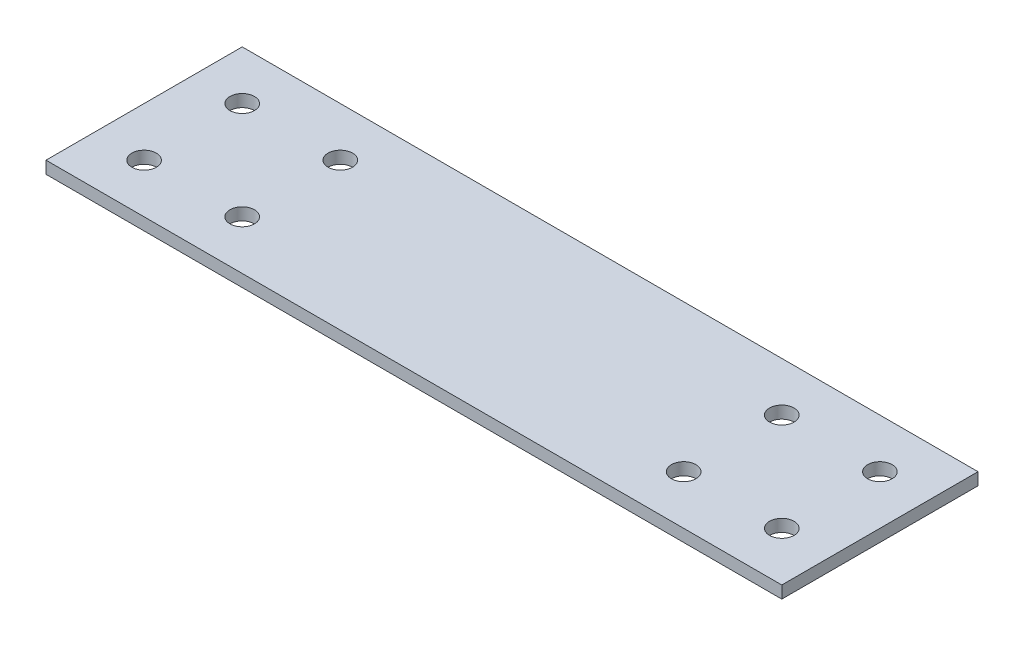
ISO-10303-21;
HEADER;
FILE_DESCRIPTION(('STEP AP214'),'2;1');
FILE_NAME('part.step','',(''),(''),'','','');
FILE_SCHEMA(('AUTOMOTIVE_DESIGN { 1 0 10303 214 1 1 1 1 }'));
ENDSEC;
DATA;
#1=APPLICATION_CONTEXT('core data for automotive mechanical design processes');
#2=APPLICATION_PROTOCOL_DEFINITION('international standard','automotive_design',2000,#1);
#3=PRODUCT_CONTEXT('',#1,'mechanical');
#4=PRODUCT('Part','Part','',(#3));
#5=PRODUCT_RELATED_PRODUCT_CATEGORY('part','',(#4));
#6=PRODUCT_DEFINITION_FORMATION('','',#4);
#7=PRODUCT_DEFINITION_CONTEXT('part definition',#1,'design');
#8=PRODUCT_DEFINITION('design','',#6,#7);
#9=PRODUCT_DEFINITION_SHAPE('','',#8);
#10=(LENGTH_UNIT() NAMED_UNIT(*) SI_UNIT(.MILLI.,.METRE.));
#11=(NAMED_UNIT(*) PLANE_ANGLE_UNIT() SI_UNIT($,.RADIAN.));
#12=(NAMED_UNIT(*) SI_UNIT($,.STERADIAN.) SOLID_ANGLE_UNIT());
#13=UNCERTAINTY_MEASURE_WITH_UNIT(LENGTH_MEASURE(1.E-05),#10,'distance_accuracy_value','');
#14=(GEOMETRIC_REPRESENTATION_CONTEXT(3) GLOBAL_UNCERTAINTY_ASSIGNED_CONTEXT((#13)) GLOBAL_UNIT_ASSIGNED_CONTEXT((#10,
#11,#12)) REPRESENTATION_CONTEXT('',''));
#15=CARTESIAN_POINT('',(0.,0.,0.));
#16=DIRECTION('',(0.,0.,1.));
#17=DIRECTION('',(1.,0.,0.));
#18=AXIS2_PLACEMENT_3D('',#15,#16,#17);
#19=CARTESIAN_POINT('',(69.85,25.4,25.4));
#20=DIRECTION('',(0.,0.,-1.));
#21=DIRECTION('',(-1.,0.,0.));
#22=AXIS2_PLACEMENT_3D('',#19,#20,#21);
#23=PLANE('',#22);
#24=DIRECTION('',(1.,0.,0.));
#25=VECTOR('',#24,1.);
#26=CARTESIAN_POINT('',(69.85,25.4,25.4));
#27=LINE('',#26,#25);
#28=CARTESIAN_POINT('',(-95.25,25.4,25.4));
#29=VERTEX_POINT('',#28);
#30=CARTESIAN_POINT('',(95.25,25.4,25.4));
#31=VERTEX_POINT('',#30);
#32=EDGE_CURVE('E44',#29,#31,#27,.T.);
#33=ORIENTED_EDGE('',*,*,#32,.F.);
#34=DIRECTION('',(0.,1.,0.));
#35=VECTOR('',#34,1.);
#36=CARTESIAN_POINT('',(-95.25,22.225,25.4));
#37=LINE('',#36,#35);
#38=CARTESIAN_POINT('',(-95.25,22.225,25.4));
#39=VERTEX_POINT('',#38);
#40=EDGE_CURVE('E108',#39,#29,#37,.T.);
#41=ORIENTED_EDGE('',*,*,#40,.F.);
#42=DIRECTION('',(-1.,0.,0.));
#43=VECTOR('',#42,1.);
#44=CARTESIAN_POINT('',(69.851,22.225,25.4));
#45=LINE('',#44,#43);
#46=CARTESIAN_POINT('',(95.25,22.225,25.4));
#47=VERTEX_POINT('',#46);
#48=EDGE_CURVE('E58',#47,#39,#45,.T.);
#49=ORIENTED_EDGE('',*,*,#48,.F.);
#50=DIRECTION('',(0.,-1.,0.));
#51=VECTOR('',#50,1.);
#52=CARTESIAN_POINT('',(95.25,25.4,25.4));
#53=LINE('',#52,#51);
#54=EDGE_CURVE('E84',#31,#47,#53,.T.);
#55=ORIENTED_EDGE('',*,*,#54,.F.);
#56=EDGE_LOOP('',(#33,#41,#49,#55));
#57=FACE_BOUND('',#56,.T.);
#58=ADVANCED_FACE('F37',(#57),#23,.F.);
#59=CARTESIAN_POINT('',(69.85,25.4,-25.4));
#60=DIRECTION('',(0.,0.,1.));
#61=DIRECTION('',(1.,0.,0.));
#62=AXIS2_PLACEMENT_3D('',#59,#60,#61);
#63=PLANE('',#62);
#64=DIRECTION('',(-1.,0.,0.));
#65=VECTOR('',#64,1.);
#66=CARTESIAN_POINT('',(69.85,25.4,-25.4));
#67=LINE('',#66,#65);
#68=CARTESIAN_POINT('',(95.25,25.4,-25.4));
#69=VERTEX_POINT('',#68);
#70=CARTESIAN_POINT('',(-95.25,25.4,-25.4));
#71=VERTEX_POINT('',#70);
#72=EDGE_CURVE('E11',#69,#71,#67,.T.);
#73=ORIENTED_EDGE('',*,*,#72,.F.);
#74=DIRECTION('',(0.,1.,0.));
#75=VECTOR('',#74,1.);
#76=CARTESIAN_POINT('',(95.25,22.225,-25.4));
#77=LINE('',#76,#75);
#78=CARTESIAN_POINT('',(95.25,22.225,-25.4));
#79=VERTEX_POINT('',#78);
#80=EDGE_CURVE('E92',#79,#69,#77,.T.);
#81=ORIENTED_EDGE('',*,*,#80,.F.);
#82=DIRECTION('',(-1.,0.,0.));
#83=VECTOR('',#82,1.);
#84=CARTESIAN_POINT('',(69.851,22.225,-25.4));
#85=LINE('',#84,#83);
#86=CARTESIAN_POINT('',(-95.25,22.225,-25.4));
#87=VERTEX_POINT('',#86);
#88=EDGE_CURVE('E82',#79,#87,#85,.T.);
#89=ORIENTED_EDGE('',*,*,#88,.T.);
#90=DIRECTION('',(0.,-1.,0.));
#91=VECTOR('',#90,1.);
#92=CARTESIAN_POINT('',(-95.25,25.4,-25.4));
#93=LINE('',#92,#91);
#94=EDGE_CURVE('E103',#71,#87,#93,.T.);
#95=ORIENTED_EDGE('',*,*,#94,.F.);
#96=EDGE_LOOP('',(#73,#81,#89,#95));
#97=FACE_BOUND('',#96,.T.);
#98=ADVANCED_FACE('F137',(#97),#63,.F.);
#99=CARTESIAN_POINT('',(0.,25.4,0.));
#100=DIRECTION('',(0.,1.,0.));
#101=DIRECTION('',(0.,0.,1.));
#102=AXIS2_PLACEMENT_3D('',#99,#100,#101);
#103=PLANE('',#102);
#104=CARTESIAN_POINT('',(82.55,25.4,-12.7));
#105=DIRECTION('',(0.,1.,0.));
#106=DIRECTION('',(0.,0.,-1.));
#107=AXIS2_PLACEMENT_3D('',#104,#105,#106);
#108=CIRCLE('',#107,3.175);
#109=CARTESIAN_POINT('',(82.55,25.4,-15.875));
#110=VERTEX_POINT('',#109);
#111=EDGE_CURVE('E346',#110,#110,#108,.T.);
#112=ORIENTED_EDGE('',*,*,#111,.F.);
#113=EDGE_LOOP('',(#112));
#114=FACE_BOUND('',#113,.T.);
#115=CARTESIAN_POINT('',(82.55,25.4,12.7000000000001));
#116=DIRECTION('',(0.,1.,0.));
#117=DIRECTION('',(0.,0.,1.));
#118=AXIS2_PLACEMENT_3D('',#115,#116,#117);
#119=CIRCLE('',#118,3.175);
#120=CARTESIAN_POINT('',(82.55,25.4,15.8750000000001));
#121=VERTEX_POINT('',#120);
#122=EDGE_CURVE('E353',#121,#121,#119,.T.);
#123=ORIENTED_EDGE('',*,*,#122,.F.);
#124=EDGE_LOOP('',(#123));
#125=FACE_BOUND('',#124,.T.);
#126=CARTESIAN_POINT('',(-82.55,25.4,12.7));
#127=DIRECTION('',(0.,1.,0.));
#128=DIRECTION('',(0.,0.,-1.));
#129=AXIS2_PLACEMENT_3D('',#126,#127,#128);
#130=CIRCLE('',#129,3.175);
#131=CARTESIAN_POINT('',(-82.55,25.4,9.52500000000002));
#132=VERTEX_POINT('',#131);
#133=EDGE_CURVE('E356',#132,#132,#130,.T.);
#134=ORIENTED_EDGE('',*,*,#133,.F.);
#135=EDGE_LOOP('',(#134));
#136=FACE_BOUND('',#135,.T.);
#137=CARTESIAN_POINT('',(-82.55,25.4,-12.7));
#138=DIRECTION('',(0.,1.,0.));
#139=DIRECTION('',(0.,0.,1.));
#140=AXIS2_PLACEMENT_3D('',#137,#138,#139);
#141=CIRCLE('',#140,3.175);
#142=CARTESIAN_POINT('',(-82.55,25.4,-9.52500000000001));
#143=VERTEX_POINT('',#142);
#144=EDGE_CURVE('E96',#143,#143,#141,.T.);
#145=ORIENTED_EDGE('',*,*,#144,.F.);
#146=EDGE_LOOP('',(#145));
#147=FACE_BOUND('',#146,.T.);
#148=CARTESIAN_POINT('',(57.15,25.4,-12.7));
#149=DIRECTION('',(0.,1.,0.));
#150=DIRECTION('',(0.,0.,-1.));
#151=AXIS2_PLACEMENT_3D('',#148,#149,#150);
#152=CIRCLE('',#151,3.175);
#153=CARTESIAN_POINT('',(57.15,25.4,-9.52500000000002));
#154=VERTEX_POINT('',#153);
#155=EDGE_CURVE('E124',#154,#154,#152,.T.);
#156=ORIENTED_EDGE('',*,*,#155,.F.);
#157=EDGE_LOOP('',(#156));
#158=FACE_BOUND('',#157,.T.);
#159=CARTESIAN_POINT('',(57.15,25.4,12.7));
#160=DIRECTION('',(0.,1.,0.));
#161=DIRECTION('',(0.,0.,1.));
#162=AXIS2_PLACEMENT_3D('',#159,#160,#161);
#163=CIRCLE('',#162,3.175);
#164=CARTESIAN_POINT('',(57.15,25.4,15.875));
#165=VERTEX_POINT('',#164);
#166=EDGE_CURVE('E118',#165,#165,#163,.T.);
#167=ORIENTED_EDGE('',*,*,#166,.F.);
#168=EDGE_LOOP('',(#167));
#169=FACE_BOUND('',#168,.T.);
#170=CARTESIAN_POINT('',(-57.15,25.4,12.7));
#171=DIRECTION('',(0.,1.,0.));
#172=DIRECTION('',(0.,0.,-1.));
#173=AXIS2_PLACEMENT_3D('',#170,#171,#172);
#174=CIRCLE('',#173,3.175);
#175=CARTESIAN_POINT('',(-57.15,25.4,15.875));
#176=VERTEX_POINT('',#175);
#177=EDGE_CURVE('E111',#176,#176,#174,.T.);
#178=ORIENTED_EDGE('',*,*,#177,.F.);
#179=EDGE_LOOP('',(#178));
#180=FACE_BOUND('',#179,.T.);
#181=CARTESIAN_POINT('',(-57.15,25.4,-12.7));
#182=DIRECTION('',(0.,1.,0.));
#183=DIRECTION('',(0.,0.,1.));
#184=AXIS2_PLACEMENT_3D('',#181,#182,#183);
#185=CIRCLE('',#184,3.175);
#186=CARTESIAN_POINT('',(-57.15,25.4,-9.52500000000002));
#187=VERTEX_POINT('',#186);
#188=EDGE_CURVE('E114',#187,#187,#185,.T.);
#189=ORIENTED_EDGE('',*,*,#188,.F.);
#190=EDGE_LOOP('',(#189));
#191=FACE_BOUND('',#190,.T.);
#192=ORIENTED_EDGE('',*,*,#72,.T.);
#193=DIRECTION('',(0.,0.,-1.));
#194=VECTOR('',#193,1.);
#195=CARTESIAN_POINT('',(-95.25,25.4,25.4));
#196=LINE('',#195,#194);
#197=EDGE_CURVE('E81',#29,#71,#196,.T.);
#198=ORIENTED_EDGE('',*,*,#197,.F.);
#199=ORIENTED_EDGE('',*,*,#32,.T.);
#200=DIRECTION('',(0.,0.,1.));
#201=VECTOR('',#200,1.);
#202=CARTESIAN_POINT('',(95.25,25.4,-25.4));
#203=LINE('',#202,#201);
#204=EDGE_CURVE('E79',#69,#31,#203,.T.);
#205=ORIENTED_EDGE('',*,*,#204,.F.);
#206=EDGE_LOOP('',(#192,#198,#199,#205));
#207=FACE_BOUND('',#206,.T.);
#208=ADVANCED_FACE('F77',(#114,#125,#136,#147,#158,#169,#180,#191,#207),#103,.T.);
#209=CARTESIAN_POINT('',(69.851,22.225,25.4));
#210=DIRECTION('',(0.,1.,0.));
#211=DIRECTION('',(0.,0.,1.));
#212=AXIS2_PLACEMENT_3D('',#209,#210,#211);
#213=PLANE('',#212);
#214=CARTESIAN_POINT('',(82.55,22.225,-12.7));
#215=DIRECTION('',(0.,1.,0.));
#216=DIRECTION('',(0.,0.,1.));
#217=AXIS2_PLACEMENT_3D('',#214,#215,#216);
#218=CIRCLE('',#217,3.175);
#219=CARTESIAN_POINT('',(82.55,22.225,-9.52499999999997));
#220=VERTEX_POINT('',#219);
#221=EDGE_CURVE('E348',#220,#220,#218,.F.);
#222=ORIENTED_EDGE('',*,*,#221,.F.);
#223=EDGE_LOOP('',(#222));
#224=FACE_BOUND('',#223,.T.);
#225=CARTESIAN_POINT('',(82.55,22.225,12.7000000000001));
#226=DIRECTION('',(0.,1.,0.));
#227=DIRECTION('',(0.,0.,1.));
#228=AXIS2_PLACEMENT_3D('',#225,#226,#227);
#229=CIRCLE('',#228,3.175);
#230=CARTESIAN_POINT('',(82.55,22.225,15.8750000000001));
#231=VERTEX_POINT('',#230);
#232=EDGE_CURVE('E350',#231,#231,#229,.F.);
#233=ORIENTED_EDGE('',*,*,#232,.F.);
#234=EDGE_LOOP('',(#233));
#235=FACE_BOUND('',#234,.T.);
#236=CARTESIAN_POINT('',(-82.55,22.225,12.7));
#237=DIRECTION('',(0.,1.,0.));
#238=DIRECTION('',(0.,0.,1.));
#239=AXIS2_PLACEMENT_3D('',#236,#237,#238);
#240=CIRCLE('',#239,3.175);
#241=CARTESIAN_POINT('',(-82.55,22.225,15.875));
#242=VERTEX_POINT('',#241);
#243=EDGE_CURVE('E359',#242,#242,#240,.F.);
#244=ORIENTED_EDGE('',*,*,#243,.F.);
#245=EDGE_LOOP('',(#244));
#246=FACE_BOUND('',#245,.T.);
#247=CARTESIAN_POINT('',(-82.55,22.225,-12.7));
#248=DIRECTION('',(0.,1.,0.));
#249=DIRECTION('',(0.,0.,1.));
#250=AXIS2_PLACEMENT_3D('',#247,#248,#249);
#251=CIRCLE('',#250,3.175);
#252=CARTESIAN_POINT('',(-82.55,22.225,-9.52500000000001));
#253=VERTEX_POINT('',#252);
#254=EDGE_CURVE('E93',#253,#253,#251,.F.);
#255=ORIENTED_EDGE('',*,*,#254,.F.);
#256=EDGE_LOOP('',(#255));
#257=FACE_BOUND('',#256,.T.);
#258=CARTESIAN_POINT('',(57.15,22.225,-12.7));
#259=DIRECTION('',(0.,1.,0.));
#260=DIRECTION('',(0.,0.,-1.));
#261=AXIS2_PLACEMENT_3D('',#258,#259,#260);
#262=CIRCLE('',#261,3.175);
#263=CARTESIAN_POINT('',(57.15,22.225,-9.52500000000002));
#264=VERTEX_POINT('',#263);
#265=EDGE_CURVE('E110',#264,#264,#262,.T.);
#266=ORIENTED_EDGE('',*,*,#265,.T.);
#267=EDGE_LOOP('',(#266));
#268=FACE_BOUND('',#267,.T.);
#269=CARTESIAN_POINT('',(57.15,22.225,12.7));
#270=DIRECTION('',(0.,1.,0.));
#271=DIRECTION('',(0.,0.,1.));
#272=AXIS2_PLACEMENT_3D('',#269,#270,#271);
#273=CIRCLE('',#272,3.175);
#274=CARTESIAN_POINT('',(57.15,22.225,15.875));
#275=VERTEX_POINT('',#274);
#276=EDGE_CURVE('E121',#275,#275,#273,.T.);
#277=ORIENTED_EDGE('',*,*,#276,.T.);
#278=EDGE_LOOP('',(#277));
#279=FACE_BOUND('',#278,.T.);
#280=CARTESIAN_POINT('',(-57.15,22.225,12.7));
#281=DIRECTION('',(0.,1.,0.));
#282=DIRECTION('',(0.,0.,-1.));
#283=AXIS2_PLACEMENT_3D('',#280,#281,#282);
#284=CIRCLE('',#283,3.175);
#285=CARTESIAN_POINT('',(-57.15,22.225,15.875));
#286=VERTEX_POINT('',#285);
#287=EDGE_CURVE('E115',#286,#286,#284,.T.);
#288=ORIENTED_EDGE('',*,*,#287,.T.);
#289=EDGE_LOOP('',(#288));
#290=FACE_BOUND('',#289,.T.);
#291=CARTESIAN_POINT('',(-57.15,22.225,-12.7));
#292=DIRECTION('',(0.,1.,0.));
#293=DIRECTION('',(0.,0.,1.));
#294=AXIS2_PLACEMENT_3D('',#291,#292,#293);
#295=CIRCLE('',#294,3.175);
#296=CARTESIAN_POINT('',(-57.15,22.225,-9.52500000000002));
#297=VERTEX_POINT('',#296);
#298=EDGE_CURVE('E129',#297,#297,#295,.T.);
#299=ORIENTED_EDGE('',*,*,#298,.T.);
#300=EDGE_LOOP('',(#299));
#301=FACE_BOUND('',#300,.T.);
#302=ORIENTED_EDGE('',*,*,#88,.F.);
#303=DIRECTION('',(0.,0.,-1.));
#304=VECTOR('',#303,1.);
#305=CARTESIAN_POINT('',(95.25,22.225,25.4));
#306=LINE('',#305,#304);
#307=EDGE_CURVE('E87',#47,#79,#306,.T.);
#308=ORIENTED_EDGE('',*,*,#307,.F.);
#309=ORIENTED_EDGE('',*,*,#48,.T.);
#310=DIRECTION('',(0.,0.,1.));
#311=VECTOR('',#310,1.);
#312=CARTESIAN_POINT('',(-95.25,22.225,-25.4));
#313=LINE('',#312,#311);
#314=EDGE_CURVE('E106',#87,#39,#313,.T.);
#315=ORIENTED_EDGE('',*,*,#314,.F.);
#316=EDGE_LOOP('',(#302,#308,#309,#315));
#317=FACE_BOUND('',#316,.T.);
#318=ADVANCED_FACE('F140',(#224,#235,#246,#257,#268,#279,#290,#301,#317),#213,.F.);
#319=CARTESIAN_POINT('',(-57.15,22.225,-12.7));
#320=DIRECTION('',(0.,1.,0.));
#321=DIRECTION('',(0.,0.,1.));
#322=AXIS2_PLACEMENT_3D('',#319,#320,#321);
#323=CYLINDRICAL_SURFACE('',#322,3.175);
#324=CARTESIAN_POINT('',(-57.15,22.225,-9.52500000000002));
#325=CARTESIAN_POINT('',(-57.15,22.2580729166667,-9.52500000000002));
#326=CARTESIAN_POINT('',(-57.15,22.2911458333333,-9.52500000000002));
#327=CARTESIAN_POINT('',(-57.15,22.3572916666667,-9.52500000000002));
#328=CARTESIAN_POINT('',(-57.15,22.3903645833333,-9.52500000000002));
#329=CARTESIAN_POINT('',(-57.15,22.4565104166667,-9.52500000000002));
#330=CARTESIAN_POINT('',(-57.15,22.4895833333333,-9.52500000000002));
#331=CARTESIAN_POINT('',(-57.15,22.5557291666667,-9.52500000000002));
#332=CARTESIAN_POINT('',(-57.15,22.5888020833333,-9.52500000000002));
#333=CARTESIAN_POINT('',(-57.15,22.6549479166667,-9.52500000000002));
#334=CARTESIAN_POINT('',(-57.15,22.6880208333333,-9.52500000000002));
#335=CARTESIAN_POINT('',(-57.15,22.7541666666667,-9.52500000000002));
#336=CARTESIAN_POINT('',(-57.15,22.7872395833333,-9.52500000000002));
#337=CARTESIAN_POINT('',(-57.15,22.8533854166667,-9.52500000000002));
#338=CARTESIAN_POINT('',(-57.15,22.8864583333333,-9.52500000000002));
#339=CARTESIAN_POINT('',(-57.15,22.9526041666667,-9.52500000000002));
#340=CARTESIAN_POINT('',(-57.15,22.9856770833333,-9.52500000000002));
#341=CARTESIAN_POINT('',(-57.15,23.0518229166667,-9.52500000000002));
#342=CARTESIAN_POINT('',(-57.15,23.0848958333333,-9.52500000000002));
#343=CARTESIAN_POINT('',(-57.15,23.1510416666667,-9.52500000000002));
#344=CARTESIAN_POINT('',(-57.15,23.1841145833333,-9.52500000000002));
#345=CARTESIAN_POINT('',(-57.15,23.2502604166667,-9.52500000000002));
#346=CARTESIAN_POINT('',(-57.15,23.2833333333333,-9.52500000000002));
#347=CARTESIAN_POINT('',(-57.15,23.3494791666667,-9.52500000000002));
#348=CARTESIAN_POINT('',(-57.15,23.3825520833333,-9.52500000000002));
#349=CARTESIAN_POINT('',(-57.15,23.4486979166667,-9.52500000000002));
#350=CARTESIAN_POINT('',(-57.15,23.4817708333333,-9.52500000000002));
#351=CARTESIAN_POINT('',(-57.15,23.5479166666667,-9.52500000000002));
#352=CARTESIAN_POINT('',(-57.15,23.5809895833333,-9.52500000000002));
#353=CARTESIAN_POINT('',(-57.15,23.6471354166667,-9.52500000000002));
#354=CARTESIAN_POINT('',(-57.15,23.6802083333333,-9.52500000000002));
#355=CARTESIAN_POINT('',(-57.15,23.7463541666667,-9.52500000000002));
#356=CARTESIAN_POINT('',(-57.15,23.7794270833333,-9.52500000000002));
#357=CARTESIAN_POINT('',(-57.15,23.8455729166667,-9.52500000000002));
#358=CARTESIAN_POINT('',(-57.15,23.8786458333333,-9.52500000000002));
#359=CARTESIAN_POINT('',(-57.15,23.9447916666667,-9.52500000000002));
#360=CARTESIAN_POINT('',(-57.15,23.9778645833333,-9.52500000000002));
#361=CARTESIAN_POINT('',(-57.15,24.0440104166667,-9.52500000000002));
#362=CARTESIAN_POINT('',(-57.15,24.0770833333333,-9.52500000000002));
#363=CARTESIAN_POINT('',(-57.15,24.1432291666667,-9.52500000000002));
#364=CARTESIAN_POINT('',(-57.15,24.1763020833333,-9.52500000000002));
#365=CARTESIAN_POINT('',(-57.15,24.2424479166667,-9.52500000000002));
#366=CARTESIAN_POINT('',(-57.15,24.2755208333333,-9.52500000000002));
#367=CARTESIAN_POINT('',(-57.15,24.3416666666667,-9.52500000000002));
#368=CARTESIAN_POINT('',(-57.15,24.3747395833333,-9.52500000000002));
#369=CARTESIAN_POINT('',(-57.15,24.4408854166667,-9.52500000000002));
#370=CARTESIAN_POINT('',(-57.15,24.4739583333333,-9.52500000000002));
#371=CARTESIAN_POINT('',(-57.15,24.5401041666667,-9.52500000000002));
#372=CARTESIAN_POINT('',(-57.15,24.5731770833333,-9.52500000000002));
#373=CARTESIAN_POINT('',(-57.15,24.6393229166667,-9.52500000000002));
#374=CARTESIAN_POINT('',(-57.15,24.6723958333333,-9.52500000000002));
#375=CARTESIAN_POINT('',(-57.15,24.7385416666667,-9.52500000000002));
#376=CARTESIAN_POINT('',(-57.15,24.7716145833333,-9.52500000000002));
#377=CARTESIAN_POINT('',(-57.15,24.8377604166667,-9.52500000000002));
#378=CARTESIAN_POINT('',(-57.15,24.8708333333333,-9.52500000000002));
#379=CARTESIAN_POINT('',(-57.15,24.9369791666667,-9.52500000000002));
#380=CARTESIAN_POINT('',(-57.15,24.9700520833333,-9.52500000000002));
#381=CARTESIAN_POINT('',(-57.15,25.0361979166667,-9.52500000000002));
#382=CARTESIAN_POINT('',(-57.15,25.0692708333333,-9.52500000000002));
#383=CARTESIAN_POINT('',(-57.15,25.1354166666667,-9.52500000000002));
#384=CARTESIAN_POINT('',(-57.15,25.1684895833333,-9.52500000000002));
#385=CARTESIAN_POINT('',(-57.15,25.2346354166667,-9.52500000000002));
#386=CARTESIAN_POINT('',(-57.15,25.2677083333333,-9.52500000000002));
#387=CARTESIAN_POINT('',(-57.15,25.3338541666667,-9.52500000000002));
#388=CARTESIAN_POINT('',(-57.15,25.3669270833333,-9.52500000000002));
#389=CARTESIAN_POINT('',(-57.15,25.4,-9.52500000000002));
#390=B_SPLINE_CURVE_WITH_KNOTS('',3,(#324,#325,#326,#327,#328,#329,#330,#331,#332,#333,#334,
#335,#336,#337,#338,#339,#340,#341,#342,#343,#344,#345,#346,#347,#348,#349,#350,#351,#352,#353,
#354,#355,#356,#357,#358,#359,#360,#361,#362,#363,#364,#365,#366,#367,#368,#369,#370,#371,#372,
#373,#374,#375,#376,#377,#378,#379,#380,#381,#382,#383,#384,#385,#386,#387,#388,#389),
.UNSPECIFIED.,.F.,.F.,(4,2,2,2,2,2,2,2,2,2,2,2,2,2,2,2,2,2,2,2,2,2,2,2,2,2,2,2,2,2,2,2,4),(0.,
0.0992187500000012,0.198437500000002,0.297656250000004,0.396875000000001,0.496093750000003,
0.595312500000004,0.694531250000005,0.793750000000003,0.892968750000004,0.992187500000005,
1.09140625,1.190625,1.28984375000001,1.3890625,1.48828125,1.58750000000001,1.68671875000001,
1.7859375,1.88515625000001,1.98437500000001,2.08359375000001,2.18281250000001,2.28203125000001,
2.38125000000001,2.48046875000001,2.57968750000001,2.67890625000001,2.77812500000001,
2.87734375000001,2.97656250000001,3.07578125000001,3.17500000000001),.UNSPECIFIED.);
#391=EDGE_CURVE('BSEAM142',#297,#187,#390,.T.);
#392=ORIENTED_EDGE('',*,*,#298,.F.);
#393=ORIENTED_EDGE('',*,*,#188,.T.);
#394=ORIENTED_EDGE('',*,*,#391,.T.);
#395=ORIENTED_EDGE('',*,*,#391,.F.);
#396=EDGE_LOOP('',(#392,#394,#393,#395));
#397=FACE_BOUND('',#396,.T.);
#398=ADVANCED_FACE('F142',(#397),#323,.F.);
#399=CARTESIAN_POINT('',(-57.15,22.225,12.7));
#400=DIRECTION('',(0.,1.,0.));
#401=DIRECTION('',(0.,0.,1.));
#402=AXIS2_PLACEMENT_3D('',#399,#400,#401);
#403=CYLINDRICAL_SURFACE('',#402,3.175);
#404=CARTESIAN_POINT('',(-57.15,22.225,15.875));
#405=CARTESIAN_POINT('',(-57.15,22.2580729166667,15.875));
#406=CARTESIAN_POINT('',(-57.15,22.2911458333333,15.875));
#407=CARTESIAN_POINT('',(-57.15,22.3572916666667,15.875));
#408=CARTESIAN_POINT('',(-57.15,22.3903645833333,15.875));
#409=CARTESIAN_POINT('',(-57.15,22.4565104166667,15.875));
#410=CARTESIAN_POINT('',(-57.15,22.4895833333333,15.875));
#411=CARTESIAN_POINT('',(-57.15,22.5557291666667,15.875));
#412=CARTESIAN_POINT('',(-57.15,22.5888020833333,15.875));
#413=CARTESIAN_POINT('',(-57.15,22.6549479166667,15.875));
#414=CARTESIAN_POINT('',(-57.15,22.6880208333333,15.875));
#415=CARTESIAN_POINT('',(-57.15,22.7541666666667,15.875));
#416=CARTESIAN_POINT('',(-57.15,22.7872395833333,15.875));
#417=CARTESIAN_POINT('',(-57.15,22.8533854166667,15.875));
#418=CARTESIAN_POINT('',(-57.15,22.8864583333333,15.875));
#419=CARTESIAN_POINT('',(-57.15,22.9526041666667,15.875));
#420=CARTESIAN_POINT('',(-57.15,22.9856770833333,15.875));
#421=CARTESIAN_POINT('',(-57.15,23.0518229166667,15.875));
#422=CARTESIAN_POINT('',(-57.15,23.0848958333333,15.875));
#423=CARTESIAN_POINT('',(-57.15,23.1510416666667,15.875));
#424=CARTESIAN_POINT('',(-57.15,23.1841145833333,15.875));
#425=CARTESIAN_POINT('',(-57.15,23.2502604166667,15.875));
#426=CARTESIAN_POINT('',(-57.15,23.2833333333333,15.875));
#427=CARTESIAN_POINT('',(-57.15,23.3494791666667,15.875));
#428=CARTESIAN_POINT('',(-57.15,23.3825520833333,15.875));
#429=CARTESIAN_POINT('',(-57.15,23.4486979166667,15.875));
#430=CARTESIAN_POINT('',(-57.15,23.4817708333333,15.875));
#431=CARTESIAN_POINT('',(-57.15,23.5479166666667,15.875));
#432=CARTESIAN_POINT('',(-57.15,23.5809895833333,15.875));
#433=CARTESIAN_POINT('',(-57.15,23.6471354166667,15.875));
#434=CARTESIAN_POINT('',(-57.15,23.6802083333333,15.875));
#435=CARTESIAN_POINT('',(-57.15,23.7463541666667,15.875));
#436=CARTESIAN_POINT('',(-57.15,23.7794270833333,15.875));
#437=CARTESIAN_POINT('',(-57.15,23.8455729166667,15.875));
#438=CARTESIAN_POINT('',(-57.15,23.8786458333333,15.875));
#439=CARTESIAN_POINT('',(-57.15,23.9447916666667,15.875));
#440=CARTESIAN_POINT('',(-57.15,23.9778645833333,15.875));
#441=CARTESIAN_POINT('',(-57.15,24.0440104166667,15.875));
#442=CARTESIAN_POINT('',(-57.15,24.0770833333333,15.875));
#443=CARTESIAN_POINT('',(-57.15,24.1432291666667,15.875));
#444=CARTESIAN_POINT('',(-57.15,24.1763020833333,15.875));
#445=CARTESIAN_POINT('',(-57.15,24.2424479166667,15.875));
#446=CARTESIAN_POINT('',(-57.15,24.2755208333333,15.875));
#447=CARTESIAN_POINT('',(-57.15,24.3416666666667,15.875));
#448=CARTESIAN_POINT('',(-57.15,24.3747395833333,15.875));
#449=CARTESIAN_POINT('',(-57.15,24.4408854166667,15.875));
#450=CARTESIAN_POINT('',(-57.15,24.4739583333333,15.875));
#451=CARTESIAN_POINT('',(-57.15,24.5401041666667,15.875));
#452=CARTESIAN_POINT('',(-57.15,24.5731770833333,15.875));
#453=CARTESIAN_POINT('',(-57.15,24.6393229166667,15.875));
#454=CARTESIAN_POINT('',(-57.15,24.6723958333333,15.875));
#455=CARTESIAN_POINT('',(-57.15,24.7385416666667,15.875));
#456=CARTESIAN_POINT('',(-57.15,24.7716145833333,15.875));
#457=CARTESIAN_POINT('',(-57.15,24.8377604166667,15.875));
#458=CARTESIAN_POINT('',(-57.15,24.8708333333333,15.875));
#459=CARTESIAN_POINT('',(-57.15,24.9369791666667,15.875));
#460=CARTESIAN_POINT('',(-57.15,24.9700520833333,15.875));
#461=CARTESIAN_POINT('',(-57.15,25.0361979166667,15.875));
#462=CARTESIAN_POINT('',(-57.15,25.0692708333333,15.875));
#463=CARTESIAN_POINT('',(-57.15,25.1354166666667,15.875));
#464=CARTESIAN_POINT('',(-57.15,25.1684895833333,15.875));
#465=CARTESIAN_POINT('',(-57.15,25.2346354166667,15.875));
#466=CARTESIAN_POINT('',(-57.15,25.2677083333333,15.875));
#467=CARTESIAN_POINT('',(-57.15,25.3338541666667,15.875));
#468=CARTESIAN_POINT('',(-57.15,25.3669270833333,15.875));
#469=CARTESIAN_POINT('',(-57.15,25.4,15.875));
#470=B_SPLINE_CURVE_WITH_KNOTS('',3,(#404,#405,#406,#407,#408,#409,#410,#411,#412,#413,#414,
#415,#416,#417,#418,#419,#420,#421,#422,#423,#424,#425,#426,#427,#428,#429,#430,#431,#432,#433,
#434,#435,#436,#437,#438,#439,#440,#441,#442,#443,#444,#445,#446,#447,#448,#449,#450,#451,#452,
#453,#454,#455,#456,#457,#458,#459,#460,#461,#462,#463,#464,#465,#466,#467,#468,#469),
.UNSPECIFIED.,.F.,.F.,(4,2,2,2,2,2,2,2,2,2,2,2,2,2,2,2,2,2,2,2,2,2,2,2,2,2,2,2,2,2,2,2,4),(0.,
0.0992187500000012,0.198437500000002,0.297656250000004,0.396875000000001,0.496093750000003,
0.595312500000004,0.694531250000005,0.793750000000003,0.892968750000004,0.992187500000005,
1.09140625,1.190625,1.28984375000001,1.3890625,1.48828125,1.58750000000001,1.68671875000001,
1.7859375,1.88515625000001,1.98437500000001,2.08359375000001,2.18281250000001,2.28203125000001,
2.38125000000001,2.48046875000001,2.57968750000001,2.67890625000001,2.77812500000001,
2.87734375000001,2.97656250000001,3.07578125000001,3.17500000000001),.UNSPECIFIED.);
#471=EDGE_CURVE('BSEAM150',#286,#176,#470,.T.);
#472=ORIENTED_EDGE('',*,*,#287,.F.);
#473=ORIENTED_EDGE('',*,*,#177,.T.);
#474=ORIENTED_EDGE('',*,*,#471,.T.);
#475=ORIENTED_EDGE('',*,*,#471,.F.);
#476=EDGE_LOOP('',(#472,#474,#473,#475));
#477=FACE_BOUND('',#476,.T.);
#478=ADVANCED_FACE('F150',(#477),#403,.F.);
#479=CARTESIAN_POINT('',(57.15,22.225,12.7));
#480=DIRECTION('',(0.,1.,0.));
#481=DIRECTION('',(0.,0.,1.));
#482=AXIS2_PLACEMENT_3D('',#479,#480,#481);
#483=CYLINDRICAL_SURFACE('',#482,3.175);
#484=CARTESIAN_POINT('',(57.15,22.225,15.875));
#485=CARTESIAN_POINT('',(57.15,22.2580729166667,15.875));
#486=CARTESIAN_POINT('',(57.15,22.2911458333333,15.875));
#487=CARTESIAN_POINT('',(57.15,22.3572916666667,15.875));
#488=CARTESIAN_POINT('',(57.15,22.3903645833333,15.875));
#489=CARTESIAN_POINT('',(57.15,22.4565104166667,15.875));
#490=CARTESIAN_POINT('',(57.15,22.4895833333333,15.875));
#491=CARTESIAN_POINT('',(57.15,22.5557291666667,15.875));
#492=CARTESIAN_POINT('',(57.15,22.5888020833333,15.875));
#493=CARTESIAN_POINT('',(57.15,22.6549479166667,15.875));
#494=CARTESIAN_POINT('',(57.15,22.6880208333333,15.875));
#495=CARTESIAN_POINT('',(57.15,22.7541666666667,15.875));
#496=CARTESIAN_POINT('',(57.15,22.7872395833333,15.875));
#497=CARTESIAN_POINT('',(57.15,22.8533854166667,15.875));
#498=CARTESIAN_POINT('',(57.15,22.8864583333333,15.875));
#499=CARTESIAN_POINT('',(57.15,22.9526041666667,15.875));
#500=CARTESIAN_POINT('',(57.15,22.9856770833333,15.875));
#501=CARTESIAN_POINT('',(57.15,23.0518229166667,15.875));
#502=CARTESIAN_POINT('',(57.15,23.0848958333333,15.875));
#503=CARTESIAN_POINT('',(57.15,23.1510416666667,15.875));
#504=CARTESIAN_POINT('',(57.15,23.1841145833333,15.875));
#505=CARTESIAN_POINT('',(57.15,23.2502604166667,15.875));
#506=CARTESIAN_POINT('',(57.15,23.2833333333333,15.875));
#507=CARTESIAN_POINT('',(57.15,23.3494791666667,15.875));
#508=CARTESIAN_POINT('',(57.15,23.3825520833333,15.875));
#509=CARTESIAN_POINT('',(57.15,23.4486979166667,15.875));
#510=CARTESIAN_POINT('',(57.15,23.4817708333333,15.875));
#511=CARTESIAN_POINT('',(57.15,23.5479166666667,15.875));
#512=CARTESIAN_POINT('',(57.15,23.5809895833333,15.875));
#513=CARTESIAN_POINT('',(57.15,23.6471354166667,15.875));
#514=CARTESIAN_POINT('',(57.15,23.6802083333333,15.875));
#515=CARTESIAN_POINT('',(57.15,23.7463541666667,15.875));
#516=CARTESIAN_POINT('',(57.15,23.7794270833333,15.875));
#517=CARTESIAN_POINT('',(57.15,23.8455729166667,15.875));
#518=CARTESIAN_POINT('',(57.15,23.8786458333333,15.875));
#519=CARTESIAN_POINT('',(57.15,23.9447916666667,15.875));
#520=CARTESIAN_POINT('',(57.15,23.9778645833333,15.875));
#521=CARTESIAN_POINT('',(57.15,24.0440104166667,15.875));
#522=CARTESIAN_POINT('',(57.15,24.0770833333333,15.875));
#523=CARTESIAN_POINT('',(57.15,24.1432291666667,15.875));
#524=CARTESIAN_POINT('',(57.15,24.1763020833333,15.875));
#525=CARTESIAN_POINT('',(57.15,24.2424479166667,15.875));
#526=CARTESIAN_POINT('',(57.15,24.2755208333333,15.875));
#527=CARTESIAN_POINT('',(57.15,24.3416666666667,15.875));
#528=CARTESIAN_POINT('',(57.15,24.3747395833333,15.875));
#529=CARTESIAN_POINT('',(57.15,24.4408854166667,15.875));
#530=CARTESIAN_POINT('',(57.15,24.4739583333333,15.875));
#531=CARTESIAN_POINT('',(57.15,24.5401041666667,15.875));
#532=CARTESIAN_POINT('',(57.15,24.5731770833333,15.875));
#533=CARTESIAN_POINT('',(57.15,24.6393229166667,15.875));
#534=CARTESIAN_POINT('',(57.15,24.6723958333333,15.875));
#535=CARTESIAN_POINT('',(57.15,24.7385416666667,15.875));
#536=CARTESIAN_POINT('',(57.15,24.7716145833333,15.875));
#537=CARTESIAN_POINT('',(57.15,24.8377604166667,15.875));
#538=CARTESIAN_POINT('',(57.15,24.8708333333333,15.875));
#539=CARTESIAN_POINT('',(57.15,24.9369791666667,15.875));
#540=CARTESIAN_POINT('',(57.15,24.9700520833333,15.875));
#541=CARTESIAN_POINT('',(57.15,25.0361979166667,15.875));
#542=CARTESIAN_POINT('',(57.15,25.0692708333333,15.875));
#543=CARTESIAN_POINT('',(57.15,25.1354166666667,15.875));
#544=CARTESIAN_POINT('',(57.15,25.1684895833333,15.875));
#545=CARTESIAN_POINT('',(57.15,25.2346354166667,15.875));
#546=CARTESIAN_POINT('',(57.15,25.2677083333333,15.875));
#547=CARTESIAN_POINT('',(57.15,25.3338541666667,15.875));
#548=CARTESIAN_POINT('',(57.15,25.3669270833333,15.875));
#549=CARTESIAN_POINT('',(57.15,25.4,15.875));
#550=B_SPLINE_CURVE_WITH_KNOTS('',3,(#484,#485,#486,#487,#488,#489,#490,#491,#492,#493,#494,
#495,#496,#497,#498,#499,#500,#501,#502,#503,#504,#505,#506,#507,#508,#509,#510,#511,#512,#513,
#514,#515,#516,#517,#518,#519,#520,#521,#522,#523,#524,#525,#526,#527,#528,#529,#530,#531,#532,
#533,#534,#535,#536,#537,#538,#539,#540,#541,#542,#543,#544,#545,#546,#547,#548,#549),
.UNSPECIFIED.,.F.,.F.,(4,2,2,2,2,2,2,2,2,2,2,2,2,2,2,2,2,2,2,2,2,2,2,2,2,2,2,2,2,2,2,2,4),(0.,
0.0992187500000012,0.198437500000002,0.297656250000004,0.396875000000001,0.496093750000003,
0.595312500000004,0.694531250000005,0.793750000000003,0.892968750000004,0.992187500000005,
1.09140625,1.190625,1.28984375000001,1.3890625,1.48828125,1.58750000000001,1.68671875000001,
1.7859375,1.88515625000001,1.98437500000001,2.08359375000001,2.18281250000001,2.28203125000001,
2.38125000000001,2.48046875000001,2.57968750000001,2.67890625000001,2.77812500000001,
2.87734375000001,2.97656250000001,3.07578125000001,3.17500000000001),.UNSPECIFIED.);
#551=EDGE_CURVE('BSEAM248',#275,#165,#550,.T.);
#552=ORIENTED_EDGE('',*,*,#276,.F.);
#553=ORIENTED_EDGE('',*,*,#166,.T.);
#554=ORIENTED_EDGE('',*,*,#551,.T.);
#555=ORIENTED_EDGE('',*,*,#551,.F.);
#556=EDGE_LOOP('',(#552,#554,#553,#555));
#557=FACE_BOUND('',#556,.T.);
#558=ADVANCED_FACE('F248',(#557),#483,.F.);
#559=CARTESIAN_POINT('',(57.15,22.225,-12.7));
#560=DIRECTION('',(0.,1.,0.));
#561=DIRECTION('',(0.,0.,1.));
#562=AXIS2_PLACEMENT_3D('',#559,#560,#561);
#563=CYLINDRICAL_SURFACE('',#562,3.175);
#564=CARTESIAN_POINT('',(57.15,22.225,-9.52500000000002));
#565=CARTESIAN_POINT('',(57.15,22.2580729166667,-9.52500000000002));
#566=CARTESIAN_POINT('',(57.15,22.2911458333333,-9.52500000000002));
#567=CARTESIAN_POINT('',(57.15,22.3572916666667,-9.52500000000002));
#568=CARTESIAN_POINT('',(57.15,22.3903645833333,-9.52500000000002));
#569=CARTESIAN_POINT('',(57.15,22.4565104166667,-9.52500000000002));
#570=CARTESIAN_POINT('',(57.15,22.4895833333333,-9.52500000000002));
#571=CARTESIAN_POINT('',(57.15,22.5557291666667,-9.52500000000002));
#572=CARTESIAN_POINT('',(57.15,22.5888020833333,-9.52500000000002));
#573=CARTESIAN_POINT('',(57.15,22.6549479166667,-9.52500000000002));
#574=CARTESIAN_POINT('',(57.15,22.6880208333333,-9.52500000000002));
#575=CARTESIAN_POINT('',(57.15,22.7541666666667,-9.52500000000002));
#576=CARTESIAN_POINT('',(57.15,22.7872395833333,-9.52500000000002));
#577=CARTESIAN_POINT('',(57.15,22.8533854166667,-9.52500000000002));
#578=CARTESIAN_POINT('',(57.15,22.8864583333333,-9.52500000000002));
#579=CARTESIAN_POINT('',(57.15,22.9526041666667,-9.52500000000002));
#580=CARTESIAN_POINT('',(57.15,22.9856770833333,-9.52500000000002));
#581=CARTESIAN_POINT('',(57.15,23.0518229166667,-9.52500000000002));
#582=CARTESIAN_POINT('',(57.15,23.0848958333333,-9.52500000000002));
#583=CARTESIAN_POINT('',(57.15,23.1510416666667,-9.52500000000002));
#584=CARTESIAN_POINT('',(57.15,23.1841145833333,-9.52500000000002));
#585=CARTESIAN_POINT('',(57.15,23.2502604166667,-9.52500000000002));
#586=CARTESIAN_POINT('',(57.15,23.2833333333333,-9.52500000000002));
#587=CARTESIAN_POINT('',(57.15,23.3494791666667,-9.52500000000002));
#588=CARTESIAN_POINT('',(57.15,23.3825520833333,-9.52500000000002));
#589=CARTESIAN_POINT('',(57.15,23.4486979166667,-9.52500000000002));
#590=CARTESIAN_POINT('',(57.15,23.4817708333333,-9.52500000000002));
#591=CARTESIAN_POINT('',(57.15,23.5479166666667,-9.52500000000002));
#592=CARTESIAN_POINT('',(57.15,23.5809895833333,-9.52500000000002));
#593=CARTESIAN_POINT('',(57.15,23.6471354166667,-9.52500000000002));
#594=CARTESIAN_POINT('',(57.15,23.6802083333333,-9.52500000000002));
#595=CARTESIAN_POINT('',(57.15,23.7463541666667,-9.52500000000002));
#596=CARTESIAN_POINT('',(57.15,23.7794270833333,-9.52500000000002));
#597=CARTESIAN_POINT('',(57.15,23.8455729166667,-9.52500000000002));
#598=CARTESIAN_POINT('',(57.15,23.8786458333333,-9.52500000000002));
#599=CARTESIAN_POINT('',(57.15,23.9447916666667,-9.52500000000002));
#600=CARTESIAN_POINT('',(57.15,23.9778645833333,-9.52500000000002));
#601=CARTESIAN_POINT('',(57.15,24.0440104166667,-9.52500000000002));
#602=CARTESIAN_POINT('',(57.15,24.0770833333333,-9.52500000000002));
#603=CARTESIAN_POINT('',(57.15,24.1432291666667,-9.52500000000002));
#604=CARTESIAN_POINT('',(57.15,24.1763020833333,-9.52500000000002));
#605=CARTESIAN_POINT('',(57.15,24.2424479166667,-9.52500000000002));
#606=CARTESIAN_POINT('',(57.15,24.2755208333333,-9.52500000000002));
#607=CARTESIAN_POINT('',(57.15,24.3416666666667,-9.52500000000002));
#608=CARTESIAN_POINT('',(57.15,24.3747395833333,-9.52500000000002));
#609=CARTESIAN_POINT('',(57.15,24.4408854166667,-9.52500000000002));
#610=CARTESIAN_POINT('',(57.15,24.4739583333333,-9.52500000000002));
#611=CARTESIAN_POINT('',(57.15,24.5401041666667,-9.52500000000002));
#612=CARTESIAN_POINT('',(57.15,24.5731770833333,-9.52500000000002));
#613=CARTESIAN_POINT('',(57.15,24.6393229166667,-9.52500000000002));
#614=CARTESIAN_POINT('',(57.15,24.6723958333333,-9.52500000000002));
#615=CARTESIAN_POINT('',(57.15,24.7385416666667,-9.52500000000002));
#616=CARTESIAN_POINT('',(57.15,24.7716145833333,-9.52500000000002));
#617=CARTESIAN_POINT('',(57.15,24.8377604166667,-9.52500000000002));
#618=CARTESIAN_POINT('',(57.15,24.8708333333333,-9.52500000000002));
#619=CARTESIAN_POINT('',(57.15,24.9369791666667,-9.52500000000002));
#620=CARTESIAN_POINT('',(57.15,24.9700520833333,-9.52500000000002));
#621=CARTESIAN_POINT('',(57.15,25.0361979166667,-9.52500000000002));
#622=CARTESIAN_POINT('',(57.15,25.0692708333333,-9.52500000000002));
#623=CARTESIAN_POINT('',(57.15,25.1354166666667,-9.52500000000002));
#624=CARTESIAN_POINT('',(57.15,25.1684895833333,-9.52500000000002));
#625=CARTESIAN_POINT('',(57.15,25.2346354166667,-9.52500000000002));
#626=CARTESIAN_POINT('',(57.15,25.2677083333333,-9.52500000000002));
#627=CARTESIAN_POINT('',(57.15,25.3338541666667,-9.52500000000002));
#628=CARTESIAN_POINT('',(57.15,25.3669270833333,-9.52500000000002));
#629=CARTESIAN_POINT('',(57.15,25.4,-9.52500000000002));
#630=B_SPLINE_CURVE_WITH_KNOTS('',3,(#564,#565,#566,#567,#568,#569,#570,#571,#572,#573,#574,
#575,#576,#577,#578,#579,#580,#581,#582,#583,#584,#585,#586,#587,#588,#589,#590,#591,#592,#593,
#594,#595,#596,#597,#598,#599,#600,#601,#602,#603,#604,#605,#606,#607,#608,#609,#610,#611,#612,
#613,#614,#615,#616,#617,#618,#619,#620,#621,#622,#623,#624,#625,#626,#627,#628,#629),
.UNSPECIFIED.,.F.,.F.,(4,2,2,2,2,2,2,2,2,2,2,2,2,2,2,2,2,2,2,2,2,2,2,2,2,2,2,2,2,2,2,2,4),(0.,
0.0992187500000012,0.198437500000002,0.297656250000004,0.396875000000001,0.496093750000003,
0.595312500000004,0.694531250000005,0.793750000000003,0.892968750000004,0.992187500000005,
1.09140625,1.190625,1.28984375000001,1.3890625,1.48828125,1.58750000000001,1.68671875000001,
1.7859375,1.88515625000001,1.98437500000001,2.08359375000001,2.18281250000001,2.28203125000001,
2.38125000000001,2.48046875000001,2.57968750000001,2.67890625000001,2.77812500000001,
2.87734375000001,2.97656250000001,3.07578125000001,3.17500000000001),.UNSPECIFIED.);
#631=EDGE_CURVE('BSEAM239',#264,#154,#630,.T.);
#632=ORIENTED_EDGE('',*,*,#265,.F.);
#633=ORIENTED_EDGE('',*,*,#155,.T.);
#634=ORIENTED_EDGE('',*,*,#631,.T.);
#635=ORIENTED_EDGE('',*,*,#631,.F.);
#636=EDGE_LOOP('',(#632,#634,#633,#635));
#637=FACE_BOUND('',#636,.T.);
#638=ADVANCED_FACE('F239',(#637),#563,.F.);
#639=CARTESIAN_POINT('',(-95.25,0.,0.));
#640=DIRECTION('',(-1.,0.,0.));
#641=DIRECTION('',(0.,0.,1.));
#642=AXIS2_PLACEMENT_3D('',#639,#640,#641);
#643=PLANE('',#642);
#644=ORIENTED_EDGE('',*,*,#197,.T.);
#645=ORIENTED_EDGE('',*,*,#94,.T.);
#646=ORIENTED_EDGE('',*,*,#314,.T.);
#647=ORIENTED_EDGE('',*,*,#40,.T.);
#648=EDGE_LOOP('',(#644,#645,#646,#647));
#649=FACE_BOUND('',#648,.T.);
#650=ADVANCED_FACE('F139',(#649),#643,.T.);
#651=CARTESIAN_POINT('',(95.25,0.,0.));
#652=DIRECTION('',(1.,0.,0.));
#653=DIRECTION('',(0.,0.,-1.));
#654=AXIS2_PLACEMENT_3D('',#651,#652,#653);
#655=PLANE('',#654);
#656=ORIENTED_EDGE('',*,*,#204,.T.);
#657=ORIENTED_EDGE('',*,*,#54,.T.);
#658=ORIENTED_EDGE('',*,*,#307,.T.);
#659=ORIENTED_EDGE('',*,*,#80,.T.);
#660=EDGE_LOOP('',(#656,#657,#658,#659));
#661=FACE_BOUND('',#660,.T.);
#662=ADVANCED_FACE('F90',(#661),#655,.T.);
#663=CARTESIAN_POINT('',(-82.55,22.224,-12.7));
#664=DIRECTION('',(0.,1.,0.));
#665=DIRECTION('',(0.,0.,1.));
#666=AXIS2_PLACEMENT_3D('',#663,#664,#665);
#667=CYLINDRICAL_SURFACE('',#666,3.175);
#668=ORIENTED_EDGE('',*,*,#144,.T.);
#669=EDGE_LOOP('',(#668));
#670=FACE_BOUND('',#669,.T.);
#671=ORIENTED_EDGE('',*,*,#254,.T.);
#672=EDGE_LOOP('',(#671));
#673=FACE_BOUND('',#672,.T.);
#674=ADVANCED_FACE('F183',(#670,#673),#667,.F.);
#675=CARTESIAN_POINT('',(-82.55,22.224,12.7));
#676=DIRECTION('',(0.,1.,0.));
#677=DIRECTION('',(0.,0.,1.));
#678=AXIS2_PLACEMENT_3D('',#675,#676,#677);
#679=CYLINDRICAL_SURFACE('',#678,3.175);
#680=ORIENTED_EDGE('',*,*,#133,.T.);
#681=EDGE_LOOP('',(#680));
#682=FACE_BOUND('',#681,.T.);
#683=ORIENTED_EDGE('',*,*,#243,.T.);
#684=EDGE_LOOP('',(#683));
#685=FACE_BOUND('',#684,.T.);
#686=ADVANCED_FACE('F188',(#682,#685),#679,.F.);
#687=CARTESIAN_POINT('',(82.55,22.224,12.7000000000001));
#688=DIRECTION('',(0.,1.,0.));
#689=DIRECTION('',(0.,0.,1.));
#690=AXIS2_PLACEMENT_3D('',#687,#688,#689);
#691=CYLINDRICAL_SURFACE('',#690,3.175);
#692=ORIENTED_EDGE('',*,*,#122,.T.);
#693=EDGE_LOOP('',(#692));
#694=FACE_BOUND('',#693,.T.);
#695=ORIENTED_EDGE('',*,*,#232,.T.);
#696=EDGE_LOOP('',(#695));
#697=FACE_BOUND('',#696,.T.);
#698=ADVANCED_FACE('F199',(#694,#697),#691,.F.);
#699=CARTESIAN_POINT('',(82.55,22.224,-12.7));
#700=DIRECTION('',(0.,1.,0.));
#701=DIRECTION('',(0.,0.,1.));
#702=AXIS2_PLACEMENT_3D('',#699,#700,#701);
#703=CYLINDRICAL_SURFACE('',#702,3.175);
#704=ORIENTED_EDGE('',*,*,#111,.T.);
#705=EDGE_LOOP('',(#704));
#706=FACE_BOUND('',#705,.T.);
#707=ORIENTED_EDGE('',*,*,#221,.T.);
#708=EDGE_LOOP('',(#707));
#709=FACE_BOUND('',#708,.T.);
#710=ADVANCED_FACE('F210',(#706,#709),#703,.F.);
#711=CLOSED_SHELL('',(#58,#98,#208,#318,#398,#478,#558,#638,#650,#662,#674,#686,#698,#710));
#712=MANIFOLD_SOLID_BREP('B2',#711);
#713=ADVANCED_BREP_SHAPE_REPRESENTATION('',(#18,#712),#14);
#714=SHAPE_DEFINITION_REPRESENTATION(#9,#713);
ENDSEC;
END-ISO-10303-21;
